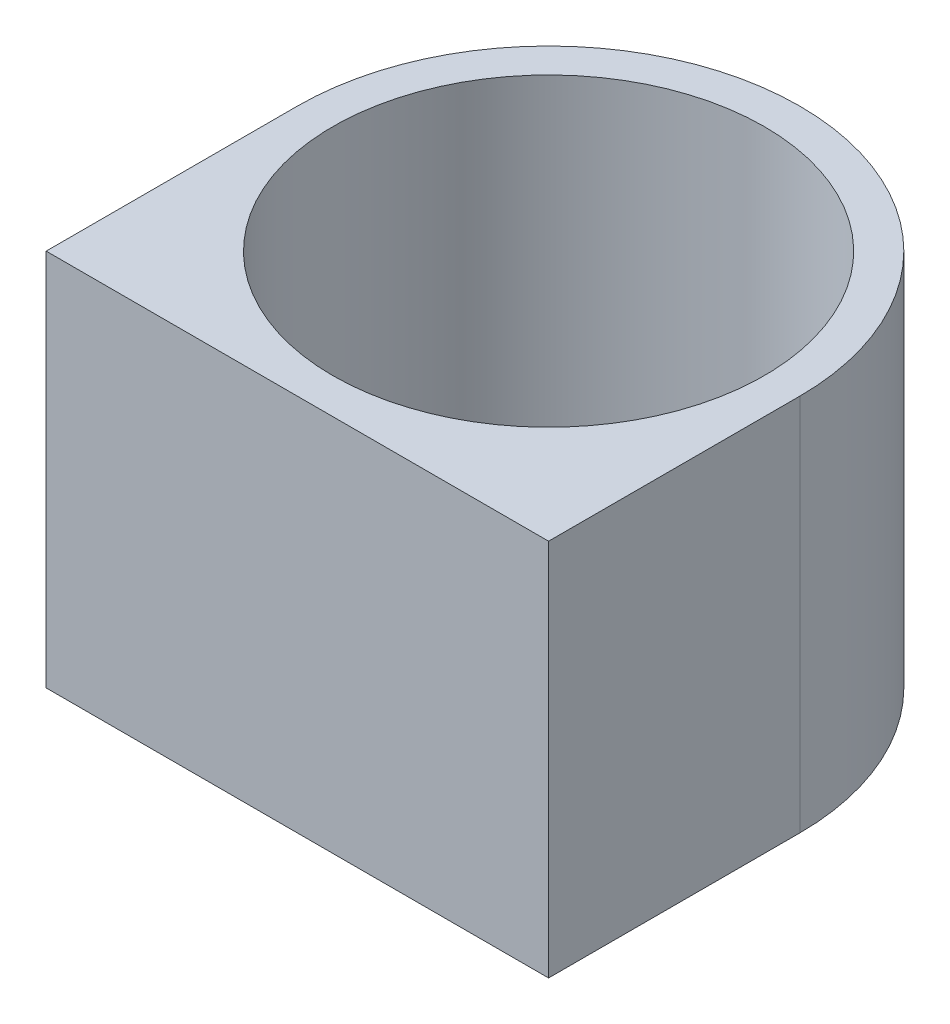
ISO-10303-21;
HEADER;
FILE_DESCRIPTION(('STEP AP214'),'2;1');
FILE_NAME('part.step','',(''),(''),'','','');
FILE_SCHEMA(('AUTOMOTIVE_DESIGN { 1 0 10303 214 1 1 1 1 }'));
ENDSEC;
DATA;
#1=APPLICATION_CONTEXT('core data for automotive mechanical design processes');
#2=APPLICATION_PROTOCOL_DEFINITION('international standard','automotive_design',2000,#1);
#3=PRODUCT_CONTEXT('',#1,'mechanical');
#4=PRODUCT('Part','Part','',(#3));
#5=PRODUCT_RELATED_PRODUCT_CATEGORY('part','',(#4));
#6=PRODUCT_DEFINITION_FORMATION('','',#4);
#7=PRODUCT_DEFINITION_CONTEXT('part definition',#1,'design');
#8=PRODUCT_DEFINITION('design','',#6,#7);
#9=PRODUCT_DEFINITION_SHAPE('','',#8);
#10=(LENGTH_UNIT() NAMED_UNIT(*) SI_UNIT(.MILLI.,.METRE.));
#11=(NAMED_UNIT(*) PLANE_ANGLE_UNIT() SI_UNIT($,.RADIAN.));
#12=(NAMED_UNIT(*) SI_UNIT($,.STERADIAN.) SOLID_ANGLE_UNIT());
#13=UNCERTAINTY_MEASURE_WITH_UNIT(LENGTH_MEASURE(1.E-05),#10,'distance_accuracy_value','');
#14=(GEOMETRIC_REPRESENTATION_CONTEXT(3) GLOBAL_UNCERTAINTY_ASSIGNED_CONTEXT((#13)) GLOBAL_UNIT_ASSIGNED_CONTEXT((#10,
#11,#12)) REPRESENTATION_CONTEXT('',''));
#15=CARTESIAN_POINT('',(0.,0.,0.));
#16=DIRECTION('',(0.,0.,1.));
#17=DIRECTION('',(1.,0.,0.));
#18=AXIS2_PLACEMENT_3D('',#15,#16,#17);
#19=CARTESIAN_POINT('',(0.,32.,0.));
#20=DIRECTION('',(0.,-1.,0.));
#21=DIRECTION('',(0.,0.,-1.));
#22=AXIS2_PLACEMENT_3D('',#19,#20,#21);
#23=CYLINDRICAL_SURFACE('',#22,21.25);
#24=CARTESIAN_POINT('',(0.,32.,0.));
#25=DIRECTION('',(0.,1.,0.));
#26=DIRECTION('',(0.,0.,1.));
#27=AXIS2_PLACEMENT_3D('',#24,#25,#26);
#28=CIRCLE('',#27,21.25);
#29=CARTESIAN_POINT('',(21.25,32.,0.));
#30=VERTEX_POINT('',#29);
#31=CARTESIAN_POINT('',(-21.25,32.,0.));
#32=VERTEX_POINT('',#31);
#33=EDGE_CURVE('E84',#30,#32,#28,.T.);
#34=ORIENTED_EDGE('',*,*,#33,.F.);
#35=DIRECTION('',(0.,-1.,0.));
#36=VECTOR('',#35,1.);
#37=CARTESIAN_POINT('',(21.25,32.,0.));
#38=LINE('',#37,#36);
#39=CARTESIAN_POINT('',(21.25,0.,0.));
#40=VERTEX_POINT('',#39);
#41=EDGE_CURVE('E79',#30,#40,#38,.T.);
#42=ORIENTED_EDGE('',*,*,#41,.T.);
#43=CARTESIAN_POINT('',(0.,0.,0.));
#44=DIRECTION('',(0.,1.,0.));
#45=DIRECTION('',(0.,0.,1.));
#46=AXIS2_PLACEMENT_3D('',#43,#44,#45);
#47=CIRCLE('',#46,21.25);
#48=CARTESIAN_POINT('',(-21.25,0.,0.));
#49=VERTEX_POINT('',#48);
#50=EDGE_CURVE('E128',#40,#49,#47,.T.);
#51=ORIENTED_EDGE('',*,*,#50,.T.);
#52=DIRECTION('',(0.,-1.,0.));
#53=VECTOR('',#52,1.);
#54=CARTESIAN_POINT('',(-21.25,32.,0.));
#55=LINE('',#54,#53);
#56=EDGE_CURVE('E145',#32,#49,#55,.T.);
#57=ORIENTED_EDGE('',*,*,#56,.F.);
#58=EDGE_LOOP('',(#34,#42,#51,#57));
#59=FACE_BOUND('',#58,.T.);
#60=ADVANCED_FACE('F61',(#59),#23,.T.);
#61=CARTESIAN_POINT('',(0.,2.,0.));
#62=DIRECTION('',(0.,-1.,0.));
#63=DIRECTION('',(0.,0.,-1.));
#64=AXIS2_PLACEMENT_3D('',#61,#62,#63);
#65=CYLINDRICAL_SURFACE('',#64,11.5);
#66=CARTESIAN_POINT('',(0.,2.,0.));
#67=DIRECTION('',(0.,1.,0.));
#68=DIRECTION('',(0.,0.,1.));
#69=AXIS2_PLACEMENT_3D('',#66,#67,#68);
#70=CIRCLE('',#69,11.5);
#71=CARTESIAN_POINT('',(0.,2.,11.5));
#72=VERTEX_POINT('',#71);
#73=EDGE_CURVE('E12',#72,#72,#70,.T.);
#74=ORIENTED_EDGE('',*,*,#73,.T.);
#75=EDGE_LOOP('',(#74));
#76=FACE_BOUND('',#75,.T.);
#77=CARTESIAN_POINT('',(0.,0.,0.));
#78=DIRECTION('',(0.,1.,0.));
#79=DIRECTION('',(0.,0.,1.));
#80=AXIS2_PLACEMENT_3D('',#77,#78,#79);
#81=CIRCLE('',#80,11.5);
#82=CARTESIAN_POINT('',(0.,0.,11.5));
#83=VERTEX_POINT('',#82);
#84=EDGE_CURVE('E65',#83,#83,#81,.T.);
#85=ORIENTED_EDGE('',*,*,#84,.F.);
#86=EDGE_LOOP('',(#85));
#87=FACE_BOUND('',#86,.T.);
#88=ADVANCED_FACE('F197',(#76,#87),#65,.F.);
#89=CARTESIAN_POINT('',(0.,2.,-14.));
#90=DIRECTION('',(0.,-1.,0.));
#91=DIRECTION('',(0.,0.,-1.));
#92=AXIS2_PLACEMENT_3D('',#89,#90,#91);
#93=CYLINDRICAL_SURFACE('',#92,1.6);
#94=CARTESIAN_POINT('',(0.,2.,-14.));
#95=DIRECTION('',(0.,1.,0.));
#96=DIRECTION('',(0.,0.,1.));
#97=AXIS2_PLACEMENT_3D('',#94,#95,#96);
#98=CIRCLE('',#97,1.6);
#99=CARTESIAN_POINT('',(0.,2.,-12.4));
#100=VERTEX_POINT('',#99);
#101=EDGE_CURVE('E71',#100,#100,#98,.T.);
#102=ORIENTED_EDGE('',*,*,#101,.T.);
#103=EDGE_LOOP('',(#102));
#104=FACE_BOUND('',#103,.T.);
#105=CARTESIAN_POINT('',(0.,0.,-14.));
#106=DIRECTION('',(0.,1.,0.));
#107=DIRECTION('',(0.,0.,1.));
#108=AXIS2_PLACEMENT_3D('',#105,#106,#107);
#109=CIRCLE('',#108,1.6);
#110=CARTESIAN_POINT('',(0.,0.,-12.4));
#111=VERTEX_POINT('',#110);
#112=EDGE_CURVE('E187',#111,#111,#109,.T.);
#113=ORIENTED_EDGE('',*,*,#112,.F.);
#114=EDGE_LOOP('',(#113));
#115=FACE_BOUND('',#114,.T.);
#116=ADVANCED_FACE('F199',(#104,#115),#93,.F.);
#117=CARTESIAN_POINT('',(14.0000000000004,2.,-3.95332173747447E-13));
#118=DIRECTION('',(0.,-1.,0.));
#119=DIRECTION('',(0.,0.,-1.));
#120=AXIS2_PLACEMENT_3D('',#117,#118,#119);
#121=CYLINDRICAL_SURFACE('',#120,1.60000000000031);
#122=CARTESIAN_POINT('',(14.0000000000004,2.,-3.95332173747447E-13));
#123=DIRECTION('',(0.,1.,0.));
#124=DIRECTION('',(0.,0.,1.));
#125=AXIS2_PLACEMENT_3D('',#122,#123,#124);
#126=CIRCLE('',#125,1.60000000000031);
#127=CARTESIAN_POINT('',(14.0000000000004,2.,1.59999999999991));
#128=VERTEX_POINT('',#127);
#129=EDGE_CURVE('E170',#128,#128,#126,.T.);
#130=ORIENTED_EDGE('',*,*,#129,.T.);
#131=EDGE_LOOP('',(#130));
#132=FACE_BOUND('',#131,.T.);
#133=CARTESIAN_POINT('',(14.0000000000004,0.,-3.95332173747447E-13));
#134=DIRECTION('',(0.,1.,0.));
#135=DIRECTION('',(0.,0.,1.));
#136=AXIS2_PLACEMENT_3D('',#133,#134,#135);
#137=CIRCLE('',#136,1.60000000000031);
#138=CARTESIAN_POINT('',(14.0000000000004,0.,1.59999999999991));
#139=VERTEX_POINT('',#138);
#140=EDGE_CURVE('E184',#139,#139,#137,.T.);
#141=ORIENTED_EDGE('',*,*,#140,.F.);
#142=EDGE_LOOP('',(#141));
#143=FACE_BOUND('',#142,.T.);
#144=ADVANCED_FACE('F206',(#132,#143),#121,.F.);
#145=CARTESIAN_POINT('',(7.90664347494893E-13,2.,14.));
#146=DIRECTION('',(0.,-1.,0.));
#147=DIRECTION('',(0.,0.,-1.));
#148=AXIS2_PLACEMENT_3D('',#145,#146,#147);
#149=CYLINDRICAL_SURFACE('',#148,1.60000000000085);
#150=CARTESIAN_POINT('',(7.90664347494893E-13,2.,14.));
#151=DIRECTION('',(0.,1.,0.));
#152=DIRECTION('',(0.,0.,1.));
#153=AXIS2_PLACEMENT_3D('',#150,#151,#152);
#154=CIRCLE('',#153,1.60000000000085);
#155=CARTESIAN_POINT('',(7.90664347494893E-13,2.,15.6000000000008));
#156=VERTEX_POINT('',#155);
#157=EDGE_CURVE('E166',#156,#156,#154,.T.);
#158=ORIENTED_EDGE('',*,*,#157,.T.);
#159=EDGE_LOOP('',(#158));
#160=FACE_BOUND('',#159,.T.);
#161=CARTESIAN_POINT('',(7.90664347494893E-13,0.,14.));
#162=DIRECTION('',(0.,1.,0.));
#163=DIRECTION('',(0.,0.,1.));
#164=AXIS2_PLACEMENT_3D('',#161,#162,#163);
#165=CIRCLE('',#164,1.60000000000085);
#166=CARTESIAN_POINT('',(7.90664347494893E-13,0.,15.6000000000008));
#167=VERTEX_POINT('',#166);
#168=EDGE_CURVE('E180',#167,#167,#165,.T.);
#169=ORIENTED_EDGE('',*,*,#168,.F.);
#170=EDGE_LOOP('',(#169));
#171=FACE_BOUND('',#170,.T.);
#172=ADVANCED_FACE('F214',(#160,#171),#149,.F.);
#173=CARTESIAN_POINT('',(-13.9999999999996,2.,3.97046679266253E-13));
#174=DIRECTION('',(0.,-1.,0.));
#175=DIRECTION('',(0.,0.,-1.));
#176=AXIS2_PLACEMENT_3D('',#173,#174,#175);
#177=CYLINDRICAL_SURFACE('',#176,1.60000000000064);
#178=CARTESIAN_POINT('',(-13.9999999999996,2.,3.97046679266253E-13));
#179=DIRECTION('',(0.,1.,0.));
#180=DIRECTION('',(0.,0.,1.));
#181=AXIS2_PLACEMENT_3D('',#178,#179,#180);
#182=CIRCLE('',#181,1.60000000000064);
#183=CARTESIAN_POINT('',(-13.9999999999996,2.,1.60000000000103));
#184=VERTEX_POINT('',#183);
#185=EDGE_CURVE('E162',#184,#184,#182,.T.);
#186=ORIENTED_EDGE('',*,*,#185,.T.);
#187=EDGE_LOOP('',(#186));
#188=FACE_BOUND('',#187,.T.);
#189=CARTESIAN_POINT('',(-13.9999999999996,0.,3.97046679266253E-13));
#190=DIRECTION('',(0.,1.,0.));
#191=DIRECTION('',(0.,0.,1.));
#192=AXIS2_PLACEMENT_3D('',#189,#190,#191);
#193=CIRCLE('',#192,1.60000000000064);
#194=CARTESIAN_POINT('',(-13.9999999999996,0.,1.60000000000103));
#195=VERTEX_POINT('',#194);
#196=EDGE_CURVE('E161',#195,#195,#193,.T.);
#197=ORIENTED_EDGE('',*,*,#196,.F.);
#198=EDGE_LOOP('',(#197));
#199=FACE_BOUND('',#198,.T.);
#200=ADVANCED_FACE('F63',(#188,#199),#177,.F.);
#201=CARTESIAN_POINT('',(0.,2.,0.));
#202=DIRECTION('',(0.,1.,0.));
#203=DIRECTION('',(0.,0.,1.));
#204=AXIS2_PLACEMENT_3D('',#201,#202,#203);
#205=PLANE('',#204);
#206=ORIENTED_EDGE('',*,*,#185,.F.);
#207=EDGE_LOOP('',(#206));
#208=FACE_BOUND('',#207,.T.);
#209=ORIENTED_EDGE('',*,*,#157,.F.);
#210=EDGE_LOOP('',(#209));
#211=FACE_BOUND('',#210,.T.);
#212=ORIENTED_EDGE('',*,*,#129,.F.);
#213=EDGE_LOOP('',(#212));
#214=FACE_BOUND('',#213,.T.);
#215=ORIENTED_EDGE('',*,*,#101,.F.);
#216=EDGE_LOOP('',(#215));
#217=FACE_BOUND('',#216,.T.);
#218=ORIENTED_EDGE('',*,*,#73,.F.);
#219=EDGE_LOOP('',(#218));
#220=FACE_BOUND('',#219,.T.);
#221=CARTESIAN_POINT('',(0.,2.,0.));
#222=DIRECTION('',(0.,1.,0.));
#223=DIRECTION('',(0.,0.,1.));
#224=AXIS2_PLACEMENT_3D('',#221,#222,#223);
#225=CIRCLE('',#224,18.25);
#226=CARTESIAN_POINT('',(0.,2.,18.25));
#227=VERTEX_POINT('',#226);
#228=EDGE_CURVE('E155',#227,#227,#225,.F.);
#229=ORIENTED_EDGE('',*,*,#228,.F.);
#230=EDGE_LOOP('',(#229));
#231=FACE_BOUND('',#230,.T.);
#232=ADVANCED_FACE('F221',(#208,#211,#214,#217,#220,#231),#205,.T.);
#233=CARTESIAN_POINT('',(0.,0.,0.));
#234=DIRECTION('',(0.,1.,0.));
#235=DIRECTION('',(0.,0.,1.));
#236=AXIS2_PLACEMENT_3D('',#233,#234,#235);
#237=PLANE('',#236);
#238=ORIENTED_EDGE('',*,*,#196,.T.);
#239=EDGE_LOOP('',(#238));
#240=FACE_BOUND('',#239,.T.);
#241=ORIENTED_EDGE('',*,*,#168,.T.);
#242=EDGE_LOOP('',(#241));
#243=FACE_BOUND('',#242,.T.);
#244=ORIENTED_EDGE('',*,*,#140,.T.);
#245=EDGE_LOOP('',(#244));
#246=FACE_BOUND('',#245,.T.);
#247=ORIENTED_EDGE('',*,*,#112,.T.);
#248=EDGE_LOOP('',(#247));
#249=FACE_BOUND('',#248,.T.);
#250=ORIENTED_EDGE('',*,*,#84,.T.);
#251=EDGE_LOOP('',(#250));
#252=FACE_BOUND('',#251,.T.);
#253=ORIENTED_EDGE('',*,*,#50,.F.);
#254=DIRECTION('',(0.,0.,-1.));
#255=VECTOR('',#254,1.);
#256=CARTESIAN_POINT('',(21.25,0.,0.));
#257=LINE('',#256,#255);
#258=CARTESIAN_POINT('',(21.25,0.,21.25));
#259=VERTEX_POINT('',#258);
#260=EDGE_CURVE('E123',#259,#40,#257,.T.);
#261=ORIENTED_EDGE('',*,*,#260,.F.);
#262=DIRECTION('',(1.,0.,0.));
#263=VECTOR('',#262,1.);
#264=CARTESIAN_POINT('',(0.,0.,21.25));
#265=LINE('',#264,#263);
#266=CARTESIAN_POINT('',(-21.25,0.,21.25));
#267=VERTEX_POINT('',#266);
#268=EDGE_CURVE('E105',#267,#259,#265,.T.);
#269=ORIENTED_EDGE('',*,*,#268,.F.);
#270=DIRECTION('',(0.,0.,1.));
#271=VECTOR('',#270,1.);
#272=CARTESIAN_POINT('',(-21.25,0.,0.));
#273=LINE('',#272,#271);
#274=EDGE_CURVE('E118',#49,#267,#273,.T.);
#275=ORIENTED_EDGE('',*,*,#274,.F.);
#276=EDGE_LOOP('',(#253,#261,#269,#275));
#277=FACE_BOUND('',#276,.T.);
#278=ADVANCED_FACE('F127',(#240,#243,#246,#249,#252,#277),#237,.F.);
#279=CARTESIAN_POINT('',(0.,32.,0.));
#280=DIRECTION('',(0.,-1.,0.));
#281=DIRECTION('',(0.,0.,-1.));
#282=AXIS2_PLACEMENT_3D('',#279,#280,#281);
#283=CYLINDRICAL_SURFACE('',#282,18.25);
#284=ORIENTED_EDGE('',*,*,#228,.T.);
#285=EDGE_LOOP('',(#284));
#286=FACE_BOUND('',#285,.T.);
#287=CARTESIAN_POINT('',(0.,32.,0.));
#288=DIRECTION('',(0.,1.,0.));
#289=DIRECTION('',(0.,0.,1.));
#290=AXIS2_PLACEMENT_3D('',#287,#288,#289);
#291=CIRCLE('',#290,18.25);
#292=CARTESIAN_POINT('',(0.,32.,18.25));
#293=VERTEX_POINT('',#292);
#294=EDGE_CURVE('E149',#293,#293,#291,.T.);
#295=ORIENTED_EDGE('',*,*,#294,.T.);
#296=EDGE_LOOP('',(#295));
#297=FACE_BOUND('',#296,.T.);
#298=ADVANCED_FACE('F229',(#286,#297),#283,.F.);
#299=CARTESIAN_POINT('',(0.,32.,0.));
#300=DIRECTION('',(0.,1.,0.));
#301=DIRECTION('',(0.,0.,1.));
#302=AXIS2_PLACEMENT_3D('',#299,#300,#301);
#303=PLANE('',#302);
#304=ORIENTED_EDGE('',*,*,#294,.F.);
#305=EDGE_LOOP('',(#304));
#306=FACE_BOUND('',#305,.T.);
#307=DIRECTION('',(1.,0.,0.));
#308=VECTOR('',#307,1.);
#309=CARTESIAN_POINT('',(0.,32.,21.25));
#310=LINE('',#309,#308);
#311=CARTESIAN_POINT('',(-21.25,32.,21.25));
#312=VERTEX_POINT('',#311);
#313=CARTESIAN_POINT('',(21.25,32.,21.25));
#314=VERTEX_POINT('',#313);
#315=EDGE_CURVE('E138',#312,#314,#310,.T.);
#316=ORIENTED_EDGE('',*,*,#315,.T.);
#317=DIRECTION('',(0.,0.,-1.));
#318=VECTOR('',#317,1.);
#319=CARTESIAN_POINT('',(21.25,32.,0.));
#320=LINE('',#319,#318);
#321=EDGE_CURVE('E124',#314,#30,#320,.T.);
#322=ORIENTED_EDGE('',*,*,#321,.T.);
#323=ORIENTED_EDGE('',*,*,#33,.T.);
#324=DIRECTION('',(0.,0.,1.));
#325=VECTOR('',#324,1.);
#326=CARTESIAN_POINT('',(-21.25,32.,0.));
#327=LINE('',#326,#325);
#328=EDGE_CURVE('E117',#32,#312,#327,.T.);
#329=ORIENTED_EDGE('',*,*,#328,.T.);
#330=EDGE_LOOP('',(#316,#322,#323,#329));
#331=FACE_BOUND('',#330,.T.);
#332=ADVANCED_FACE('F237',(#306,#331),#303,.T.);
#333=CARTESIAN_POINT('',(-21.25,32.,0.));
#334=DIRECTION('',(1.,0.,0.));
#335=DIRECTION('',(0.,0.,-1.));
#336=AXIS2_PLACEMENT_3D('',#333,#334,#335);
#337=PLANE('',#336);
#338=ORIENTED_EDGE('',*,*,#274,.T.);
#339=DIRECTION('',(0.,-1.,0.));
#340=VECTOR('',#339,1.);
#341=CARTESIAN_POINT('',(-21.25,32.,21.25));
#342=LINE('',#341,#340);
#343=EDGE_CURVE('E112',#312,#267,#342,.T.);
#344=ORIENTED_EDGE('',*,*,#343,.F.);
#345=ORIENTED_EDGE('',*,*,#328,.F.);
#346=ORIENTED_EDGE('',*,*,#56,.T.);
#347=EDGE_LOOP('',(#338,#344,#345,#346));
#348=FACE_BOUND('',#347,.T.);
#349=ADVANCED_FACE('F250',(#348),#337,.F.);
#350=CARTESIAN_POINT('',(0.,32.,21.25));
#351=DIRECTION('',(0.,0.,-1.));
#352=DIRECTION('',(-1.,0.,0.));
#353=AXIS2_PLACEMENT_3D('',#350,#351,#352);
#354=PLANE('',#353);
#355=ORIENTED_EDGE('',*,*,#268,.T.);
#356=DIRECTION('',(0.,-1.,0.));
#357=VECTOR('',#356,1.);
#358=CARTESIAN_POINT('',(21.25,32.,21.25));
#359=LINE('',#358,#357);
#360=EDGE_CURVE('E109',#314,#259,#359,.T.);
#361=ORIENTED_EDGE('',*,*,#360,.F.);
#362=ORIENTED_EDGE('',*,*,#315,.F.);
#363=ORIENTED_EDGE('',*,*,#343,.T.);
#364=EDGE_LOOP('',(#355,#361,#362,#363));
#365=FACE_BOUND('',#364,.T.);
#366=ADVANCED_FACE('F107',(#365),#354,.F.);
#367=CARTESIAN_POINT('',(21.25,32.,0.));
#368=DIRECTION('',(-1.,0.,0.));
#369=DIRECTION('',(0.,0.,1.));
#370=AXIS2_PLACEMENT_3D('',#367,#368,#369);
#371=PLANE('',#370);
#372=ORIENTED_EDGE('',*,*,#260,.T.);
#373=ORIENTED_EDGE('',*,*,#41,.F.);
#374=ORIENTED_EDGE('',*,*,#321,.F.);
#375=ORIENTED_EDGE('',*,*,#360,.T.);
#376=EDGE_LOOP('',(#372,#373,#374,#375));
#377=FACE_BOUND('',#376,.T.);
#378=ADVANCED_FACE('F122',(#377),#371,.F.);
#379=CLOSED_SHELL('',(#60,#88,#116,#144,#172,#200,#232,#278,#298,#332,#349,#366,#378));
#380=MANIFOLD_SOLID_BREP('B2',#379);
#381=ADVANCED_BREP_SHAPE_REPRESENTATION('',(#18,#380),#14);
#382=SHAPE_DEFINITION_REPRESENTATION(#9,#381);
ENDSEC;
END-ISO-10303-21;
